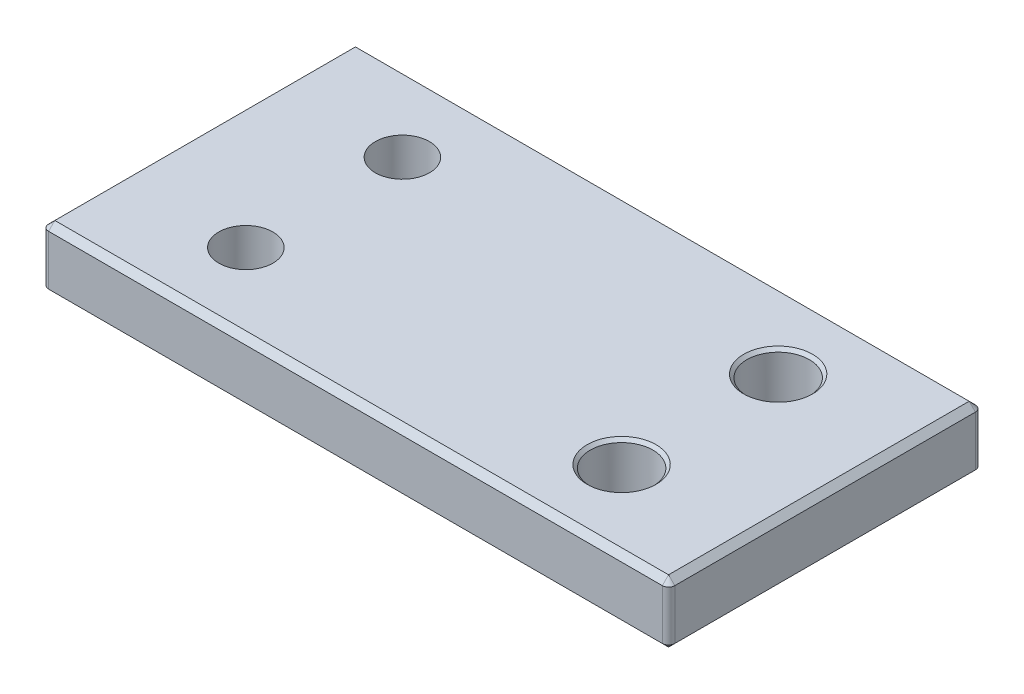
ISO-10303-21;
HEADER;
FILE_DESCRIPTION(('STEP AP214'),'2;1');
FILE_NAME('part.step','',(''),(''),'','','');
FILE_SCHEMA(('AUTOMOTIVE_DESIGN { 1 0 10303 214 1 1 1 1 }'));
ENDSEC;
DATA;
#1=APPLICATION_CONTEXT('core data for automotive mechanical design processes');
#2=APPLICATION_PROTOCOL_DEFINITION('international standard','automotive_design',2000,#1);
#3=PRODUCT_CONTEXT('',#1,'mechanical');
#4=PRODUCT('Part','Part','',(#3));
#5=PRODUCT_RELATED_PRODUCT_CATEGORY('part','',(#4));
#6=PRODUCT_DEFINITION_FORMATION('','',#4);
#7=PRODUCT_DEFINITION_CONTEXT('part definition',#1,'design');
#8=PRODUCT_DEFINITION('design','',#6,#7);
#9=PRODUCT_DEFINITION_SHAPE('','',#8);
#10=(LENGTH_UNIT() NAMED_UNIT(*) SI_UNIT(.MILLI.,.METRE.));
#11=(NAMED_UNIT(*) PLANE_ANGLE_UNIT() SI_UNIT($,.RADIAN.));
#12=(NAMED_UNIT(*) SI_UNIT($,.STERADIAN.) SOLID_ANGLE_UNIT());
#13=UNCERTAINTY_MEASURE_WITH_UNIT(LENGTH_MEASURE(1.E-05),#10,'distance_accuracy_value','');
#14=(GEOMETRIC_REPRESENTATION_CONTEXT(3) GLOBAL_UNCERTAINTY_ASSIGNED_CONTEXT((#13)) GLOBAL_UNIT_ASSIGNED_CONTEXT((#10,
#11,#12)) REPRESENTATION_CONTEXT('',''));
#15=CARTESIAN_POINT('',(0.,0.,0.));
#16=DIRECTION('',(0.,0.,1.));
#17=DIRECTION('',(1.,0.,0.));
#18=AXIS2_PLACEMENT_3D('',#15,#16,#17);
#19=CARTESIAN_POINT('',(-50.,10.,25.));
#20=DIRECTION('',(1.,0.,0.));
#21=DIRECTION('',(0.,0.,-1.));
#22=AXIS2_PLACEMENT_3D('',#19,#20,#21);
#23=PLANE('',#22);
#24=DIRECTION('',(0.,-1.,0.));
#25=VECTOR('',#24,1.);
#26=CARTESIAN_POINT('',(-50.,10.,24.));
#27=LINE('',#26,#25);
#28=CARTESIAN_POINT('',(-50.,1.,24.));
#29=VERTEX_POINT('',#28);
#30=CARTESIAN_POINT('',(-50.,9.00000000000001,24.));
#31=VERTEX_POINT('',#30);
#32=EDGE_CURVE('E166',#29,#31,#27,.F.);
#33=ORIENTED_EDGE('',*,*,#32,.T.);
#34=DIRECTION('',(0.,0.,-1.));
#35=VECTOR('',#34,1.);
#36=CARTESIAN_POINT('',(-50.,9.00000000000001,25.));
#37=LINE('',#36,#35);
#38=CARTESIAN_POINT('',(-50.,9.00000000000001,-24.));
#39=VERTEX_POINT('',#38);
#40=EDGE_CURVE('E199',#31,#39,#37,.T.);
#41=ORIENTED_EDGE('',*,*,#40,.T.);
#42=DIRECTION('',(0.,-1.,0.));
#43=VECTOR('',#42,1.);
#44=CARTESIAN_POINT('',(-50.,10.,-24.));
#45=LINE('',#44,#43);
#46=CARTESIAN_POINT('',(-50.,1.,-24.));
#47=VERTEX_POINT('',#46);
#48=EDGE_CURVE('E163',#39,#47,#45,.T.);
#49=ORIENTED_EDGE('',*,*,#48,.T.);
#50=DIRECTION('',(0.,0.,1.));
#51=VECTOR('',#50,1.);
#52=CARTESIAN_POINT('',(-50.,1.,24.));
#53=LINE('',#52,#51);
#54=EDGE_CURVE('E197',#47,#29,#53,.T.);
#55=ORIENTED_EDGE('',*,*,#54,.T.);
#56=EDGE_LOOP('',(#33,#41,#49,#55));
#57=FACE_BOUND('',#56,.T.);
#58=ADVANCED_FACE('F35',(#57),#23,.F.);
#59=CARTESIAN_POINT('',(50.,10.,25.));
#60=DIRECTION('',(0.,0.,-1.));
#61=DIRECTION('',(-1.,0.,0.));
#62=AXIS2_PLACEMENT_3D('',#59,#60,#61);
#63=PLANE('',#62);
#64=DIRECTION('',(0.,-1.,0.));
#65=VECTOR('',#64,1.);
#66=CARTESIAN_POINT('',(49.,10.,25.));
#67=LINE('',#66,#65);
#68=CARTESIAN_POINT('',(49.,1.,25.));
#69=VERTEX_POINT('',#68);
#70=CARTESIAN_POINT('',(49.,9.00000000000001,25.));
#71=VERTEX_POINT('',#70);
#72=EDGE_CURVE('E293',#69,#71,#67,.F.);
#73=ORIENTED_EDGE('',*,*,#72,.T.);
#74=DIRECTION('',(-1.,0.,0.));
#75=VECTOR('',#74,1.);
#76=CARTESIAN_POINT('',(50.,9.00000000000001,25.));
#77=LINE('',#76,#75);
#78=CARTESIAN_POINT('',(-49.,9.00000000000001,25.));
#79=VERTEX_POINT('',#78);
#80=EDGE_CURVE('E175',#71,#79,#77,.T.);
#81=ORIENTED_EDGE('',*,*,#80,.T.);
#82=DIRECTION('',(0.,-1.,0.));
#83=VECTOR('',#82,1.);
#84=CARTESIAN_POINT('',(-49.,10.,25.));
#85=LINE('',#84,#83);
#86=CARTESIAN_POINT('',(-49.,1.,25.));
#87=VERTEX_POINT('',#86);
#88=EDGE_CURVE('E290',#79,#87,#85,.T.);
#89=ORIENTED_EDGE('',*,*,#88,.T.);
#90=DIRECTION('',(1.,0.,0.));
#91=VECTOR('',#90,1.);
#92=CARTESIAN_POINT('',(49.,1.,25.));
#93=LINE('',#92,#91);
#94=EDGE_CURVE('E173',#87,#69,#93,.T.);
#95=ORIENTED_EDGE('',*,*,#94,.T.);
#96=EDGE_LOOP('',(#73,#81,#89,#95));
#97=FACE_BOUND('',#96,.T.);
#98=ADVANCED_FACE('F357',(#97),#63,.F.);
#99=CARTESIAN_POINT('',(50.,10.,-25.));
#100=DIRECTION('',(-1.,0.,0.));
#101=DIRECTION('',(0.,0.,1.));
#102=AXIS2_PLACEMENT_3D('',#99,#100,#101);
#103=PLANE('',#102);
#104=DIRECTION('',(0.,-1.,0.));
#105=VECTOR('',#104,1.);
#106=CARTESIAN_POINT('',(50.,10.,-24.));
#107=LINE('',#106,#105);
#108=CARTESIAN_POINT('',(50.,1.,-24.));
#109=VERTEX_POINT('',#108);
#110=CARTESIAN_POINT('',(50.,9.00000000000001,-24.));
#111=VERTEX_POINT('',#110);
#112=EDGE_CURVE('E287',#109,#111,#107,.F.);
#113=ORIENTED_EDGE('',*,*,#112,.T.);
#114=DIRECTION('',(0.,0.,1.));
#115=VECTOR('',#114,1.);
#116=CARTESIAN_POINT('',(50.,9.00000000000001,-25.));
#117=LINE('',#116,#115);
#118=CARTESIAN_POINT('',(50.,9.00000000000001,24.));
#119=VERTEX_POINT('',#118);
#120=EDGE_CURVE('E185',#111,#119,#117,.T.);
#121=ORIENTED_EDGE('',*,*,#120,.T.);
#122=DIRECTION('',(0.,-1.,0.));
#123=VECTOR('',#122,1.);
#124=CARTESIAN_POINT('',(50.,10.,24.));
#125=LINE('',#124,#123);
#126=CARTESIAN_POINT('',(50.,1.,24.));
#127=VERTEX_POINT('',#126);
#128=EDGE_CURVE('E284',#119,#127,#125,.T.);
#129=ORIENTED_EDGE('',*,*,#128,.T.);
#130=DIRECTION('',(0.,0.,-1.));
#131=VECTOR('',#130,1.);
#132=CARTESIAN_POINT('',(50.,1.,-24.));
#133=LINE('',#132,#131);
#134=EDGE_CURVE('E182',#127,#109,#133,.T.);
#135=ORIENTED_EDGE('',*,*,#134,.T.);
#136=EDGE_LOOP('',(#113,#121,#129,#135));
#137=FACE_BOUND('',#136,.T.);
#138=ADVANCED_FACE('F326',(#137),#103,.F.);
#139=CARTESIAN_POINT('',(-50.,10.,-25.));
#140=DIRECTION('',(0.,0.,1.));
#141=DIRECTION('',(1.,0.,0.));
#142=AXIS2_PLACEMENT_3D('',#139,#140,#141);
#143=PLANE('',#142);
#144=DIRECTION('',(0.,-1.,0.));
#145=VECTOR('',#144,1.);
#146=CARTESIAN_POINT('',(-49.,10.,-25.));
#147=LINE('',#146,#145);
#148=CARTESIAN_POINT('',(-49.,1.,-25.));
#149=VERTEX_POINT('',#148);
#150=CARTESIAN_POINT('',(-49.,9.00000000000001,-25.));
#151=VERTEX_POINT('',#150);
#152=EDGE_CURVE('E273',#149,#151,#147,.F.);
#153=ORIENTED_EDGE('',*,*,#152,.T.);
#154=DIRECTION('',(1.,0.,0.));
#155=VECTOR('',#154,1.);
#156=CARTESIAN_POINT('',(-50.,9.00000000000001,-25.));
#157=LINE('',#156,#155);
#158=CARTESIAN_POINT('',(49.,9.00000000000001,-25.));
#159=VERTEX_POINT('',#158);
#160=EDGE_CURVE('E145',#151,#159,#157,.T.);
#161=ORIENTED_EDGE('',*,*,#160,.T.);
#162=DIRECTION('',(0.,-1.,0.));
#163=VECTOR('',#162,1.);
#164=CARTESIAN_POINT('',(49.,10.,-25.));
#165=LINE('',#164,#163);
#166=CARTESIAN_POINT('',(49.,1.,-25.));
#167=VERTEX_POINT('',#166);
#168=EDGE_CURVE('E281',#159,#167,#165,.T.);
#169=ORIENTED_EDGE('',*,*,#168,.T.);
#170=DIRECTION('',(-1.,0.,0.));
#171=VECTOR('',#170,1.);
#172=CARTESIAN_POINT('',(-49.,1.,-25.));
#173=LINE('',#172,#171);
#174=EDGE_CURVE('E191',#167,#149,#173,.T.);
#175=ORIENTED_EDGE('',*,*,#174,.T.);
#176=EDGE_LOOP('',(#153,#161,#169,#175));
#177=FACE_BOUND('',#176,.T.);
#178=ADVANCED_FACE('F335',(#177),#143,.F.);
#179=CARTESIAN_POINT('',(0.,10.,0.));
#180=DIRECTION('',(0.,-1.,0.));
#181=DIRECTION('',(0.,0.,-1.));
#182=AXIS2_PLACEMENT_3D('',#179,#180,#181);
#183=PLANE('',#182);
#184=CARTESIAN_POINT('',(30.,10.,12.5));
#185=DIRECTION('',(0.,-1.,0.));
#186=DIRECTION('',(0.,0.,-1.));
#187=AXIS2_PLACEMENT_3D('',#184,#185,#186);
#188=CIRCLE('',#187,5.49999999999999);
#189=CARTESIAN_POINT('',(30.,10.,7.00000000000001));
#190=VERTEX_POINT('',#189);
#191=EDGE_CURVE('E43',#190,#190,#188,.T.);
#192=ORIENTED_EDGE('',*,*,#191,.T.);
#193=EDGE_LOOP('',(#192));
#194=FACE_BOUND('',#193,.T.);
#195=CARTESIAN_POINT('',(30.,10.,-12.5));
#196=DIRECTION('',(0.,-1.,0.));
#197=DIRECTION('',(0.,0.,-1.));
#198=AXIS2_PLACEMENT_3D('',#195,#196,#197);
#199=CIRCLE('',#198,5.50000000000001);
#200=CARTESIAN_POINT('',(30.,10.,-18.));
#201=VERTEX_POINT('',#200);
#202=EDGE_CURVE('E246',#201,#201,#199,.T.);
#203=ORIENTED_EDGE('',*,*,#202,.T.);
#204=EDGE_LOOP('',(#203));
#205=FACE_BOUND('',#204,.T.);
#206=DIRECTION('',(0.,0.,1.));
#207=VECTOR('',#206,1.);
#208=CARTESIAN_POINT('',(-49.,10.,0.));
#209=LINE('',#208,#207);
#210=CARTESIAN_POINT('',(-49.,10.,-24.));
#211=VERTEX_POINT('',#210);
#212=CARTESIAN_POINT('',(-49.,10.,24.));
#213=VERTEX_POINT('',#212);
#214=EDGE_CURVE('E132',#211,#213,#209,.T.);
#215=ORIENTED_EDGE('',*,*,#214,.T.);
#216=DIRECTION('',(1.,0.,0.));
#217=VECTOR('',#216,1.);
#218=CARTESIAN_POINT('',(0.,10.,24.));
#219=LINE('',#218,#217);
#220=CARTESIAN_POINT('',(49.,10.,24.));
#221=VERTEX_POINT('',#220);
#222=EDGE_CURVE('E171',#213,#221,#219,.T.);
#223=ORIENTED_EDGE('',*,*,#222,.T.);
#224=DIRECTION('',(0.,0.,-1.));
#225=VECTOR('',#224,1.);
#226=CARTESIAN_POINT('',(49.,10.,0.));
#227=LINE('',#226,#225);
#228=CARTESIAN_POINT('',(49.,10.,-24.));
#229=VERTEX_POINT('',#228);
#230=EDGE_CURVE('E135',#221,#229,#227,.T.);
#231=ORIENTED_EDGE('',*,*,#230,.T.);
#232=DIRECTION('',(-1.,0.,0.));
#233=VECTOR('',#232,1.);
#234=CARTESIAN_POINT('',(0.,10.,-24.));
#235=LINE('',#234,#233);
#236=EDGE_CURVE('E126',#229,#211,#235,.T.);
#237=ORIENTED_EDGE('',*,*,#236,.T.);
#238=EDGE_LOOP('',(#215,#223,#231,#237));
#239=FACE_BOUND('',#238,.T.);
#240=CARTESIAN_POINT('',(-30.,10.,12.5));
#241=DIRECTION('',(0.,1.,0.));
#242=DIRECTION('',(0.,0.,1.));
#243=AXIS2_PLACEMENT_3D('',#240,#241,#242);
#244=CIRCLE('',#243,4.3235);
#245=CARTESIAN_POINT('',(-30.,10.,16.8235));
#246=VERTEX_POINT('',#245);
#247=EDGE_CURVE('E148',#246,#246,#244,.T.);
#248=ORIENTED_EDGE('',*,*,#247,.F.);
#249=EDGE_LOOP('',(#248));
#250=FACE_BOUND('',#249,.T.);
#251=CARTESIAN_POINT('',(-30.,10.,-12.5));
#252=DIRECTION('',(0.,1.,0.));
#253=DIRECTION('',(0.,0.,1.));
#254=AXIS2_PLACEMENT_3D('',#251,#252,#253);
#255=CIRCLE('',#254,4.3235);
#256=CARTESIAN_POINT('',(-30.,10.,-8.1765));
#257=VERTEX_POINT('',#256);
#258=EDGE_CURVE('E276',#257,#257,#255,.T.);
#259=ORIENTED_EDGE('',*,*,#258,.F.);
#260=EDGE_LOOP('',(#259));
#261=FACE_BOUND('',#260,.T.);
#262=ADVANCED_FACE('F128',(#194,#205,#239,#250,#261),#183,.F.);
#263=CARTESIAN_POINT('',(0.,0.,0.));
#264=DIRECTION('',(0.,-1.,0.));
#265=DIRECTION('',(0.,0.,-1.));
#266=AXIS2_PLACEMENT_3D('',#263,#264,#265);
#267=PLANE('',#266);
#268=DIRECTION('',(1.,0.,0.));
#269=VECTOR('',#268,1.);
#270=CARTESIAN_POINT('',(49.,0.,-24.));
#271=LINE('',#270,#269);
#272=CARTESIAN_POINT('',(-49.,0.,-24.));
#273=VERTEX_POINT('',#272);
#274=CARTESIAN_POINT('',(49.,0.,-24.));
#275=VERTEX_POINT('',#274);
#276=EDGE_CURVE('E205',#273,#275,#271,.T.);
#277=ORIENTED_EDGE('',*,*,#276,.T.);
#278=DIRECTION('',(0.,0.,1.));
#279=VECTOR('',#278,1.);
#280=CARTESIAN_POINT('',(49.,0.,24.));
#281=LINE('',#280,#279);
#282=CARTESIAN_POINT('',(49.,0.,24.));
#283=VERTEX_POINT('',#282);
#284=EDGE_CURVE('E210',#275,#283,#281,.T.);
#285=ORIENTED_EDGE('',*,*,#284,.T.);
#286=DIRECTION('',(-1.,0.,0.));
#287=VECTOR('',#286,1.);
#288=CARTESIAN_POINT('',(-49.,0.,24.));
#289=LINE('',#288,#287);
#290=CARTESIAN_POINT('',(-49.,0.,24.));
#291=VERTEX_POINT('',#290);
#292=EDGE_CURVE('E58',#283,#291,#289,.T.);
#293=ORIENTED_EDGE('',*,*,#292,.T.);
#294=DIRECTION('',(0.,0.,-1.));
#295=VECTOR('',#294,1.);
#296=CARTESIAN_POINT('',(-49.,0.,-24.));
#297=LINE('',#296,#295);
#298=EDGE_CURVE('E207',#291,#273,#297,.T.);
#299=ORIENTED_EDGE('',*,*,#298,.T.);
#300=EDGE_LOOP('',(#277,#285,#293,#299));
#301=FACE_BOUND('',#300,.T.);
#302=CARTESIAN_POINT('',(-30.,0.,12.5));
#303=DIRECTION('',(0.,-1.,0.));
#304=DIRECTION('',(0.,0.,-1.));
#305=AXIS2_PLACEMENT_3D('',#302,#303,#304);
#306=CIRCLE('',#305,4.3235);
#307=CARTESIAN_POINT('',(-30.,0.,8.1765));
#308=VERTEX_POINT('',#307);
#309=EDGE_CURVE('E630',#308,#308,#306,.T.);
#310=ORIENTED_EDGE('',*,*,#309,.F.);
#311=EDGE_LOOP('',(#310));
#312=FACE_BOUND('',#311,.T.);
#313=CARTESIAN_POINT('',(-30.,0.,-12.5));
#314=DIRECTION('',(0.,-1.,0.));
#315=DIRECTION('',(0.,0.,-1.));
#316=AXIS2_PLACEMENT_3D('',#313,#314,#315);
#317=CIRCLE('',#316,4.3235);
#318=CARTESIAN_POINT('',(-30.,0.,-16.8235));
#319=VERTEX_POINT('',#318);
#320=EDGE_CURVE('E270',#319,#319,#317,.T.);
#321=ORIENTED_EDGE('',*,*,#320,.F.);
#322=EDGE_LOOP('',(#321));
#323=FACE_BOUND('',#322,.T.);
#324=CARTESIAN_POINT('',(30.,0.,-12.5));
#325=DIRECTION('',(0.,1.,0.));
#326=DIRECTION('',(0.,0.,1.));
#327=AXIS2_PLACEMENT_3D('',#324,#325,#326);
#328=CIRCLE('',#327,5.);
#329=CARTESIAN_POINT('',(30.,0.,-7.5));
#330=VERTEX_POINT('',#329);
#331=EDGE_CURVE('E269',#330,#330,#328,.T.);
#332=ORIENTED_EDGE('',*,*,#331,.T.);
#333=EDGE_LOOP('',(#332));
#334=FACE_BOUND('',#333,.T.);
#335=CARTESIAN_POINT('',(30.,0.,12.5));
#336=DIRECTION('',(0.,1.,0.));
#337=DIRECTION('',(0.,0.,1.));
#338=AXIS2_PLACEMENT_3D('',#335,#336,#337);
#339=CIRCLE('',#338,5.);
#340=CARTESIAN_POINT('',(30.,0.,17.5));
#341=VERTEX_POINT('',#340);
#342=EDGE_CURVE('E267',#341,#341,#339,.T.);
#343=ORIENTED_EDGE('',*,*,#342,.T.);
#344=EDGE_LOOP('',(#343));
#345=FACE_BOUND('',#344,.T.);
#346=ADVANCED_FACE('F263',(#301,#312,#323,#334,#345),#267,.T.);
#347=CARTESIAN_POINT('',(30.,0.,12.5));
#348=DIRECTION('',(0.,1.,0.));
#349=DIRECTION('',(0.,0.,1.));
#350=AXIS2_PLACEMENT_3D('',#347,#348,#349);
#351=CYLINDRICAL_SURFACE('',#350,5.);
#352=CARTESIAN_POINT('',(30.,9.50000000000001,12.5));
#353=DIRECTION('',(0.,-1.,0.));
#354=DIRECTION('',(0.,0.,-1.));
#355=AXIS2_PLACEMENT_3D('',#352,#353,#354);
#356=CIRCLE('',#355,5.);
#357=CARTESIAN_POINT('',(30.,9.50000000000001,7.5));
#358=VERTEX_POINT('',#357);
#359=EDGE_CURVE('E212',#358,#358,#356,.F.);
#360=ORIENTED_EDGE('',*,*,#359,.T.);
#361=EDGE_LOOP('',(#360));
#362=FACE_BOUND('',#361,.T.);
#363=ORIENTED_EDGE('',*,*,#342,.F.);
#364=EDGE_LOOP('',(#363));
#365=FACE_BOUND('',#364,.T.);
#366=ADVANCED_FACE('F259',(#362,#365),#351,.F.);
#367=CARTESIAN_POINT('',(30.,0.,-12.5));
#368=DIRECTION('',(0.,1.,0.));
#369=DIRECTION('',(0.,0.,1.));
#370=AXIS2_PLACEMENT_3D('',#367,#368,#369);
#371=CYLINDRICAL_SURFACE('',#370,5.);
#372=CARTESIAN_POINT('',(30.,9.49999999999999,-12.5));
#373=DIRECTION('',(0.,-1.,0.));
#374=DIRECTION('',(0.,0.,-1.));
#375=AXIS2_PLACEMENT_3D('',#372,#373,#374);
#376=CIRCLE('',#375,5.);
#377=CARTESIAN_POINT('',(30.,9.49999999999999,-17.5));
#378=VERTEX_POINT('',#377);
#379=EDGE_CURVE('E11',#378,#378,#376,.F.);
#380=ORIENTED_EDGE('',*,*,#379,.T.);
#381=EDGE_LOOP('',(#380));
#382=FACE_BOUND('',#381,.T.);
#383=ORIENTED_EDGE('',*,*,#331,.F.);
#384=EDGE_LOOP('',(#383));
#385=FACE_BOUND('',#384,.T.);
#386=ADVANCED_FACE('F262',(#382,#385),#371,.F.);
#387=CARTESIAN_POINT('',(-30.,10.,-12.5));
#388=DIRECTION('',(0.,1.,0.));
#389=DIRECTION('',(0.,0.,1.));
#390=AXIS2_PLACEMENT_3D('',#387,#388,#389);
#391=CYLINDRICAL_SURFACE('',#390,4.3235);
#392=ORIENTED_EDGE('',*,*,#320,.T.);
#393=EDGE_LOOP('',(#392));
#394=FACE_BOUND('',#393,.T.);
#395=ORIENTED_EDGE('',*,*,#258,.T.);
#396=EDGE_LOOP('',(#395));
#397=FACE_BOUND('',#396,.T.);
#398=ADVANCED_FACE('F541',(#394,#397),#391,.F.);
#399=CARTESIAN_POINT('',(-30.,10.,12.5));
#400=DIRECTION('',(0.,1.,0.));
#401=DIRECTION('',(0.,0.,1.));
#402=AXIS2_PLACEMENT_3D('',#399,#400,#401);
#403=CYLINDRICAL_SURFACE('',#402,4.3235);
#404=ORIENTED_EDGE('',*,*,#309,.T.);
#405=EDGE_LOOP('',(#404));
#406=FACE_BOUND('',#405,.T.);
#407=ORIENTED_EDGE('',*,*,#247,.T.);
#408=EDGE_LOOP('',(#407));
#409=FACE_BOUND('',#408,.T.);
#410=ADVANCED_FACE('F385',(#406,#409),#403,.F.);
#411=CARTESIAN_POINT('',(49.,10.,-24.));
#412=DIRECTION('',(0.,-1.,0.));
#413=DIRECTION('',(0.,0.,-1.));
#414=AXIS2_PLACEMENT_3D('',#411,#412,#413);
#415=CYLINDRICAL_SURFACE('',#414,1.);
#416=ORIENTED_EDGE('',*,*,#168,.F.);
#417=CARTESIAN_POINT('',(49.,9.00000000000001,-24.));
#418=DIRECTION('',(0.,-1.,0.));
#419=DIRECTION('',(0.,0.,-1.));
#420=AXIS2_PLACEMENT_3D('',#417,#418,#419);
#421=CIRCLE('',#420,1.);
#422=EDGE_CURVE('E189',#159,#111,#421,.T.);
#423=ORIENTED_EDGE('',*,*,#422,.T.);
#424=ORIENTED_EDGE('',*,*,#112,.F.);
#425=CARTESIAN_POINT('',(49.,1.,-24.));
#426=DIRECTION('',(0.,-1.,0.));
#427=DIRECTION('',(0.,0.,-1.));
#428=AXIS2_PLACEMENT_3D('',#425,#426,#427);
#429=CIRCLE('',#428,1.);
#430=EDGE_CURVE('E187',#109,#167,#429,.F.);
#431=ORIENTED_EDGE('',*,*,#430,.T.);
#432=EDGE_LOOP('',(#416,#423,#424,#431));
#433=FACE_BOUND('',#432,.T.);
#434=ADVANCED_FACE('F324',(#433),#415,.T.);
#435=CARTESIAN_POINT('',(49.,10.,24.));
#436=DIRECTION('',(0.,-1.,0.));
#437=DIRECTION('',(0.,0.,-1.));
#438=AXIS2_PLACEMENT_3D('',#435,#436,#437);
#439=CYLINDRICAL_SURFACE('',#438,1.);
#440=ORIENTED_EDGE('',*,*,#128,.F.);
#441=CARTESIAN_POINT('',(49.,9.00000000000001,24.));
#442=DIRECTION('',(0.,-1.,0.));
#443=DIRECTION('',(0.,0.,-1.));
#444=AXIS2_PLACEMENT_3D('',#441,#442,#443);
#445=CIRCLE('',#444,1.);
#446=EDGE_CURVE('E180',#119,#71,#445,.T.);
#447=ORIENTED_EDGE('',*,*,#446,.T.);
#448=ORIENTED_EDGE('',*,*,#72,.F.);
#449=CARTESIAN_POINT('',(49.,1.,24.));
#450=DIRECTION('',(0.,-1.,0.));
#451=DIRECTION('',(0.,0.,-1.));
#452=AXIS2_PLACEMENT_3D('',#449,#450,#451);
#453=CIRCLE('',#452,1.);
#454=EDGE_CURVE('E178',#69,#127,#453,.F.);
#455=ORIENTED_EDGE('',*,*,#454,.T.);
#456=EDGE_LOOP('',(#440,#447,#448,#455));
#457=FACE_BOUND('',#456,.T.);
#458=ADVANCED_FACE('F361',(#457),#439,.T.);
#459=CARTESIAN_POINT('',(-49.,10.,-24.));
#460=DIRECTION('',(0.,-1.,0.));
#461=DIRECTION('',(0.,0.,-1.));
#462=AXIS2_PLACEMENT_3D('',#459,#460,#461);
#463=CYLINDRICAL_SURFACE('',#462,1.);
#464=ORIENTED_EDGE('',*,*,#48,.F.);
#465=CARTESIAN_POINT('',(-49.,9.00000000000001,-24.));
#466=DIRECTION('',(0.,-1.,0.));
#467=DIRECTION('',(0.,0.,-1.));
#468=AXIS2_PLACEMENT_3D('',#465,#466,#467);
#469=CIRCLE('',#468,1.);
#470=EDGE_CURVE('E154',#39,#151,#469,.T.);
#471=ORIENTED_EDGE('',*,*,#470,.T.);
#472=ORIENTED_EDGE('',*,*,#152,.F.);
#473=CARTESIAN_POINT('',(-49.,1.,-24.));
#474=DIRECTION('',(0.,-1.,0.));
#475=DIRECTION('',(0.,0.,-1.));
#476=AXIS2_PLACEMENT_3D('',#473,#474,#475);
#477=CIRCLE('',#476,1.);
#478=EDGE_CURVE('E194',#149,#47,#477,.F.);
#479=ORIENTED_EDGE('',*,*,#478,.T.);
#480=EDGE_LOOP('',(#464,#471,#472,#479));
#481=FACE_BOUND('',#480,.T.);
#482=ADVANCED_FACE('F346',(#481),#463,.T.);
#483=CARTESIAN_POINT('',(-49.,10.,24.));
#484=DIRECTION('',(0.,-1.,0.));
#485=DIRECTION('',(0.,0.,-1.));
#486=AXIS2_PLACEMENT_3D('',#483,#484,#485);
#487=CYLINDRICAL_SURFACE('',#486,1.);
#488=ORIENTED_EDGE('',*,*,#88,.F.);
#489=CARTESIAN_POINT('',(-49.,9.00000000000001,24.));
#490=DIRECTION('',(0.,-1.,0.));
#491=DIRECTION('',(0.,0.,-1.));
#492=AXIS2_PLACEMENT_3D('',#489,#490,#491);
#493=CIRCLE('',#492,1.);
#494=EDGE_CURVE('E203',#79,#31,#493,.T.);
#495=ORIENTED_EDGE('',*,*,#494,.T.);
#496=ORIENTED_EDGE('',*,*,#32,.F.);
#497=CARTESIAN_POINT('',(-49.,1.,24.));
#498=DIRECTION('',(0.,-1.,0.));
#499=DIRECTION('',(0.,0.,-1.));
#500=AXIS2_PLACEMENT_3D('',#497,#498,#499);
#501=CIRCLE('',#500,1.);
#502=EDGE_CURVE('E201',#29,#87,#501,.F.);
#503=ORIENTED_EDGE('',*,*,#502,.T.);
#504=EDGE_LOOP('',(#488,#495,#496,#503));
#505=FACE_BOUND('',#504,.T.);
#506=ADVANCED_FACE('F355',(#505),#487,.T.);
#507=CARTESIAN_POINT('',(0.,10.,-24.));
#508=DIRECTION('',(0.,-0.707106781186547,0.707106781186547));
#509=DIRECTION('',(-1.,0.,0.));
#510=AXIS2_PLACEMENT_3D('',#507,#508,#509);
#511=PLANE('',#510);
#512=DIRECTION('',(0.,0.707106781186547,0.707106781186547));
#513=VECTOR('',#512,1.);
#514=CARTESIAN_POINT('',(49.,9.00000000000001,-25.));
#515=LINE('',#514,#513);
#516=EDGE_CURVE('E149',#159,#229,#515,.T.);
#517=ORIENTED_EDGE('',*,*,#516,.F.);
#518=ORIENTED_EDGE('',*,*,#160,.F.);
#519=DIRECTION('',(0.,-0.707106781186547,-0.707106781186547));
#520=VECTOR('',#519,1.);
#521=CARTESIAN_POINT('',(-49.,10.,-24.));
#522=LINE('',#521,#520);
#523=EDGE_CURVE('E142',#211,#151,#522,.T.);
#524=ORIENTED_EDGE('',*,*,#523,.F.);
#525=ORIENTED_EDGE('',*,*,#236,.F.);
#526=EDGE_LOOP('',(#517,#518,#524,#525));
#527=FACE_BOUND('',#526,.T.);
#528=ADVANCED_FACE('F144',(#527),#511,.F.);
#529=CARTESIAN_POINT('',(-49.,9.00000000000001,-24.));
#530=DIRECTION('',(0.,-1.,0.));
#531=DIRECTION('',(0.,0.,-1.));
#532=AXIS2_PLACEMENT_3D('',#529,#530,#531);
#533=CONICAL_SURFACE('',#532,0.999999999999987,0.785398163397448);
#534=ORIENTED_EDGE('',*,*,#523,.T.);
#535=ORIENTED_EDGE('',*,*,#470,.F.);
#536=DIRECTION('',(-0.707106781186547,-0.707106781186547,0.));
#537=VECTOR('',#536,1.);
#538=CARTESIAN_POINT('',(-49.,10.,-24.));
#539=LINE('',#538,#537);
#540=EDGE_CURVE('E152',#211,#39,#539,.T.);
#541=ORIENTED_EDGE('',*,*,#540,.F.);
#542=EDGE_LOOP('',(#534,#535,#541));
#543=FACE_BOUND('',#542,.T.);
#544=ADVANCED_FACE('F153',(#543),#533,.T.);
#545=CARTESIAN_POINT('',(49.,9.00000000000001,-24.));
#546=DIRECTION('',(0.,-1.,0.));
#547=DIRECTION('',(0.,0.,-1.));
#548=AXIS2_PLACEMENT_3D('',#545,#546,#547);
#549=CONICAL_SURFACE('',#548,0.999999999999987,0.785398163397448);
#550=ORIENTED_EDGE('',*,*,#422,.F.);
#551=ORIENTED_EDGE('',*,*,#516,.T.);
#552=DIRECTION('',(-0.707106781186547,0.707106781186547,0.));
#553=VECTOR('',#552,1.);
#554=CARTESIAN_POINT('',(50.,9.00000000000001,-24.));
#555=LINE('',#554,#553);
#556=EDGE_CURVE('E157',#111,#229,#555,.T.);
#557=ORIENTED_EDGE('',*,*,#556,.F.);
#558=EDGE_LOOP('',(#550,#551,#557));
#559=FACE_BOUND('',#558,.T.);
#560=ADVANCED_FACE('F320',(#559),#549,.T.);
#561=CARTESIAN_POINT('',(-49.,10.,0.));
#562=DIRECTION('',(0.707106781186547,-0.707106781186547,0.));
#563=DIRECTION('',(0.,0.,1.));
#564=AXIS2_PLACEMENT_3D('',#561,#562,#563);
#565=PLANE('',#564);
#566=ORIENTED_EDGE('',*,*,#540,.T.);
#567=ORIENTED_EDGE('',*,*,#40,.F.);
#568=DIRECTION('',(-0.707106781186547,-0.707106781186547,0.));
#569=VECTOR('',#568,1.);
#570=CARTESIAN_POINT('',(-49.,10.,24.));
#571=LINE('',#570,#569);
#572=EDGE_CURVE('E161',#213,#31,#571,.T.);
#573=ORIENTED_EDGE('',*,*,#572,.F.);
#574=ORIENTED_EDGE('',*,*,#214,.F.);
#575=EDGE_LOOP('',(#566,#567,#573,#574));
#576=FACE_BOUND('',#575,.T.);
#577=ADVANCED_FACE('F159',(#576),#565,.F.);
#578=CARTESIAN_POINT('',(49.,10.,0.));
#579=DIRECTION('',(-0.707106781186547,-0.707106781186547,0.));
#580=DIRECTION('',(0.,0.,-1.));
#581=AXIS2_PLACEMENT_3D('',#578,#579,#580);
#582=PLANE('',#581);
#583=ORIENTED_EDGE('',*,*,#556,.T.);
#584=ORIENTED_EDGE('',*,*,#230,.F.);
#585=DIRECTION('',(-0.707106781186547,0.707106781186547,0.));
#586=VECTOR('',#585,1.);
#587=CARTESIAN_POINT('',(50.,9.00000000000001,24.));
#588=LINE('',#587,#586);
#589=EDGE_CURVE('E218',#119,#221,#588,.T.);
#590=ORIENTED_EDGE('',*,*,#589,.F.);
#591=ORIENTED_EDGE('',*,*,#120,.F.);
#592=EDGE_LOOP('',(#583,#584,#590,#591));
#593=FACE_BOUND('',#592,.T.);
#594=ADVANCED_FACE('F316',(#593),#582,.F.);
#595=CARTESIAN_POINT('',(-49.,9.00000000000001,24.));
#596=DIRECTION('',(0.,-1.,0.));
#597=DIRECTION('',(0.,0.,-1.));
#598=AXIS2_PLACEMENT_3D('',#595,#596,#597);
#599=CONICAL_SURFACE('',#598,0.999999999999987,0.785398163397448);
#600=ORIENTED_EDGE('',*,*,#572,.T.);
#601=ORIENTED_EDGE('',*,*,#494,.F.);
#602=DIRECTION('',(0.,-0.707106781186547,0.707106781186547));
#603=VECTOR('',#602,1.);
#604=CARTESIAN_POINT('',(-49.,10.,24.));
#605=LINE('',#604,#603);
#606=EDGE_CURVE('E215',#213,#79,#605,.T.);
#607=ORIENTED_EDGE('',*,*,#606,.F.);
#608=EDGE_LOOP('',(#600,#601,#607));
#609=FACE_BOUND('',#608,.T.);
#610=ADVANCED_FACE('F304',(#609),#599,.T.);
#611=CARTESIAN_POINT('',(49.,9.00000000000001,24.));
#612=DIRECTION('',(0.,-1.,0.));
#613=DIRECTION('',(0.,0.,-1.));
#614=AXIS2_PLACEMENT_3D('',#611,#612,#613);
#615=CONICAL_SURFACE('',#614,0.999999999999987,0.785398163397448);
#616=ORIENTED_EDGE('',*,*,#446,.F.);
#617=ORIENTED_EDGE('',*,*,#589,.T.);
#618=DIRECTION('',(0.,0.707106781186547,-0.707106781186547));
#619=VECTOR('',#618,1.);
#620=CARTESIAN_POINT('',(49.,9.00000000000001,25.));
#621=LINE('',#620,#619);
#622=EDGE_CURVE('E213',#71,#221,#621,.T.);
#623=ORIENTED_EDGE('',*,*,#622,.F.);
#624=EDGE_LOOP('',(#616,#617,#623));
#625=FACE_BOUND('',#624,.T.);
#626=ADVANCED_FACE('F313',(#625),#615,.T.);
#627=CARTESIAN_POINT('',(0.,10.,24.));
#628=DIRECTION('',(0.,-0.707106781186547,-0.707106781186547));
#629=DIRECTION('',(1.,0.,0.));
#630=AXIS2_PLACEMENT_3D('',#627,#628,#629);
#631=PLANE('',#630);
#632=ORIENTED_EDGE('',*,*,#606,.T.);
#633=ORIENTED_EDGE('',*,*,#80,.F.);
#634=ORIENTED_EDGE('',*,*,#622,.T.);
#635=ORIENTED_EDGE('',*,*,#222,.F.);
#636=EDGE_LOOP('',(#632,#633,#634,#635));
#637=FACE_BOUND('',#636,.T.);
#638=ADVANCED_FACE('F308',(#637),#631,.F.);
#639=CARTESIAN_POINT('',(-50.,1.,25.));
#640=DIRECTION('',(-0.707106781186551,-0.707106781186544,0.));
#641=DIRECTION('',(0.,0.,-1.));
#642=AXIS2_PLACEMENT_3D('',#639,#640,#641);
#643=PLANE('',#642);
#644=DIRECTION('',(0.707106781186544,-0.707106781186551,0.));
#645=VECTOR('',#644,1.);
#646=CARTESIAN_POINT('',(-50.,1.,24.));
#647=LINE('',#646,#645);
#648=EDGE_CURVE('E216',#29,#291,#647,.T.);
#649=ORIENTED_EDGE('',*,*,#648,.F.);
#650=ORIENTED_EDGE('',*,*,#54,.F.);
#651=DIRECTION('',(-0.707106781186544,0.707106781186551,0.));
#652=VECTOR('',#651,1.);
#653=CARTESIAN_POINT('',(-49.,0.,-24.));
#654=LINE('',#653,#652);
#655=EDGE_CURVE('E239',#273,#47,#654,.T.);
#656=ORIENTED_EDGE('',*,*,#655,.F.);
#657=ORIENTED_EDGE('',*,*,#298,.F.);
#658=EDGE_LOOP('',(#649,#650,#656,#657));
#659=FACE_BOUND('',#658,.T.);
#660=ADVANCED_FACE('F348',(#659),#643,.T.);
#661=CARTESIAN_POINT('',(-49.,1.,24.));
#662=DIRECTION('',(0.,1.,0.));
#663=DIRECTION('',(0.,0.,1.));
#664=AXIS2_PLACEMENT_3D('',#661,#662,#663);
#665=CONICAL_SURFACE('',#664,0.999999999999997,0.785398163397445);
#666=ORIENTED_EDGE('',*,*,#502,.F.);
#667=ORIENTED_EDGE('',*,*,#648,.T.);
#668=DIRECTION('',(0.,-0.707106781186549,-0.707106781186546));
#669=VECTOR('',#668,1.);
#670=CARTESIAN_POINT('',(-49.,1.,25.));
#671=LINE('',#670,#669);
#672=EDGE_CURVE('E236',#87,#291,#671,.T.);
#673=ORIENTED_EDGE('',*,*,#672,.F.);
#674=EDGE_LOOP('',(#666,#667,#673));
#675=FACE_BOUND('',#674,.T.);
#676=ADVANCED_FACE('F352',(#675),#665,.T.);
#677=CARTESIAN_POINT('',(-49.,1.,-24.));
#678=DIRECTION('',(0.,1.,0.));
#679=DIRECTION('',(0.,0.,1.));
#680=AXIS2_PLACEMENT_3D('',#677,#678,#679);
#681=CONICAL_SURFACE('',#680,0.999999999999997,0.785398163397445);
#682=ORIENTED_EDGE('',*,*,#655,.T.);
#683=ORIENTED_EDGE('',*,*,#478,.F.);
#684=DIRECTION('',(0.,0.707106781186549,-0.707106781186546));
#685=VECTOR('',#684,1.);
#686=CARTESIAN_POINT('',(-49.,0.,-24.));
#687=LINE('',#686,#685);
#688=EDGE_CURVE('E233',#273,#149,#687,.T.);
#689=ORIENTED_EDGE('',*,*,#688,.F.);
#690=EDGE_LOOP('',(#682,#683,#689));
#691=FACE_BOUND('',#690,.T.);
#692=ADVANCED_FACE('F343',(#691),#681,.T.);
#693=CARTESIAN_POINT('',(50.,1.,25.));
#694=DIRECTION('',(0.,-0.707106781186546,0.707106781186549));
#695=DIRECTION('',(-1.,0.,0.));
#696=AXIS2_PLACEMENT_3D('',#693,#694,#695);
#697=PLANE('',#696);
#698=ORIENTED_EDGE('',*,*,#672,.T.);
#699=ORIENTED_EDGE('',*,*,#292,.F.);
#700=DIRECTION('',(0.,-0.707106781186549,-0.707106781186546));
#701=VECTOR('',#700,1.);
#702=CARTESIAN_POINT('',(49.,1.,25.));
#703=LINE('',#702,#701);
#704=EDGE_CURVE('E231',#69,#283,#703,.T.);
#705=ORIENTED_EDGE('',*,*,#704,.F.);
#706=ORIENTED_EDGE('',*,*,#94,.F.);
#707=EDGE_LOOP('',(#698,#699,#705,#706));
#708=FACE_BOUND('',#707,.T.);
#709=ADVANCED_FACE('F364',(#708),#697,.T.);
#710=CARTESIAN_POINT('',(-50.,1.,-25.));
#711=DIRECTION('',(0.,-0.707106781186546,-0.707106781186549));
#712=DIRECTION('',(1.,0.,0.));
#713=AXIS2_PLACEMENT_3D('',#710,#711,#712);
#714=PLANE('',#713);
#715=ORIENTED_EDGE('',*,*,#688,.T.);
#716=ORIENTED_EDGE('',*,*,#174,.F.);
#717=DIRECTION('',(0.,0.707106781186549,-0.707106781186546));
#718=VECTOR('',#717,1.);
#719=CARTESIAN_POINT('',(49.,0.,-24.));
#720=LINE('',#719,#718);
#721=EDGE_CURVE('E228',#275,#167,#720,.T.);
#722=ORIENTED_EDGE('',*,*,#721,.F.);
#723=ORIENTED_EDGE('',*,*,#276,.F.);
#724=EDGE_LOOP('',(#715,#716,#722,#723));
#725=FACE_BOUND('',#724,.T.);
#726=ADVANCED_FACE('F338',(#725),#714,.T.);
#727=CARTESIAN_POINT('',(49.,1.,24.));
#728=DIRECTION('',(0.,1.,0.));
#729=DIRECTION('',(0.,0.,1.));
#730=AXIS2_PLACEMENT_3D('',#727,#728,#729);
#731=CONICAL_SURFACE('',#730,0.999999999999997,0.785398163397445);
#732=ORIENTED_EDGE('',*,*,#454,.F.);
#733=ORIENTED_EDGE('',*,*,#704,.T.);
#734=DIRECTION('',(-0.707106781186544,-0.707106781186551,0.));
#735=VECTOR('',#734,1.);
#736=CARTESIAN_POINT('',(50.,1.,24.));
#737=LINE('',#736,#735);
#738=EDGE_CURVE('E50',#127,#283,#737,.T.);
#739=ORIENTED_EDGE('',*,*,#738,.F.);
#740=EDGE_LOOP('',(#732,#733,#739));
#741=FACE_BOUND('',#740,.T.);
#742=ADVANCED_FACE('F366',(#741),#731,.T.);
#743=CARTESIAN_POINT('',(49.,1.,-24.));
#744=DIRECTION('',(0.,1.,0.));
#745=DIRECTION('',(0.,0.,1.));
#746=AXIS2_PLACEMENT_3D('',#743,#744,#745);
#747=CONICAL_SURFACE('',#746,0.999999999999997,0.785398163397445);
#748=ORIENTED_EDGE('',*,*,#721,.T.);
#749=ORIENTED_EDGE('',*,*,#430,.F.);
#750=DIRECTION('',(0.707106781186544,0.707106781186551,0.));
#751=VECTOR('',#750,1.);
#752=CARTESIAN_POINT('',(49.,0.,-24.));
#753=LINE('',#752,#751);
#754=EDGE_CURVE('E225',#275,#109,#753,.T.);
#755=ORIENTED_EDGE('',*,*,#754,.F.);
#756=EDGE_LOOP('',(#748,#749,#755));
#757=FACE_BOUND('',#756,.T.);
#758=ADVANCED_FACE('F331',(#757),#747,.T.);
#759=CARTESIAN_POINT('',(50.,1.,-25.));
#760=DIRECTION('',(0.707106781186551,-0.707106781186544,0.));
#761=DIRECTION('',(0.,0.,1.));
#762=AXIS2_PLACEMENT_3D('',#759,#760,#761);
#763=PLANE('',#762);
#764=ORIENTED_EDGE('',*,*,#738,.T.);
#765=ORIENTED_EDGE('',*,*,#284,.F.);
#766=ORIENTED_EDGE('',*,*,#754,.T.);
#767=ORIENTED_EDGE('',*,*,#134,.F.);
#768=EDGE_LOOP('',(#764,#765,#766,#767));
#769=FACE_BOUND('',#768,.T.);
#770=ADVANCED_FACE('F256',(#769),#763,.T.);
#771=CARTESIAN_POINT('',(30.,9.50000000000001,12.5));
#772=DIRECTION('',(0.,1.,0.));
#773=DIRECTION('',(0.,0.,1.));
#774=AXIS2_PLACEMENT_3D('',#771,#772,#773);
#775=CONICAL_SURFACE('',#774,5.,0.785398163397448);
#776=ORIENTED_EDGE('',*,*,#191,.F.);
#777=EDGE_LOOP('',(#776));
#778=FACE_BOUND('',#777,.T.);
#779=ORIENTED_EDGE('',*,*,#359,.F.);
#780=EDGE_LOOP('',(#779));
#781=FACE_BOUND('',#780,.T.);
#782=ADVANCED_FACE('F253',(#778,#781),#775,.F.);
#783=CARTESIAN_POINT('',(30.,9.49999999999999,-12.5));
#784=DIRECTION('',(0.,1.,0.));
#785=DIRECTION('',(0.,0.,1.));
#786=AXIS2_PLACEMENT_3D('',#783,#784,#785);
#787=CONICAL_SURFACE('',#786,5.,0.785398163397438);
#788=ORIENTED_EDGE('',*,*,#202,.F.);
#789=EDGE_LOOP('',(#788));
#790=FACE_BOUND('',#789,.T.);
#791=ORIENTED_EDGE('',*,*,#379,.F.);
#792=EDGE_LOOP('',(#791));
#793=FACE_BOUND('',#792,.T.);
#794=ADVANCED_FACE('F37',(#790,#793),#787,.F.);
#795=CLOSED_SHELL('',(#58,#98,#138,#178,#262,#346,#366,#386,#398,#410,#434,#458,#482,#506,#528,
#544,#560,#577,#594,#610,#626,#638,#660,#676,#692,#709,#726,#742,#758,#770,#782,#794));
#796=MANIFOLD_SOLID_BREP('B2',#795);
#797=ADVANCED_BREP_SHAPE_REPRESENTATION('',(#18,#796),#14);
#798=SHAPE_DEFINITION_REPRESENTATION(#9,#797);
ENDSEC;
END-ISO-10303-21;
